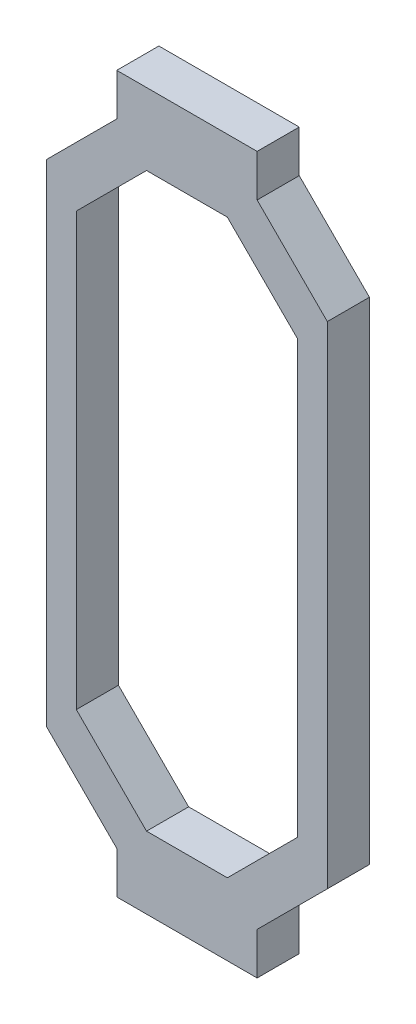
ISO-10303-21;
HEADER;
FILE_DESCRIPTION(('STEP AP214'),'2;1');
FILE_NAME('part.step','',(''),(''),'','','');
FILE_SCHEMA(('AUTOMOTIVE_DESIGN { 1 0 10303 214 1 1 1 1 }'));
ENDSEC;
DATA;
#1=APPLICATION_CONTEXT('core data for automotive mechanical design processes');
#2=APPLICATION_PROTOCOL_DEFINITION('international standard','automotive_design',2000,#1);
#3=PRODUCT_CONTEXT('',#1,'mechanical');
#4=PRODUCT('Part','Part','',(#3));
#5=PRODUCT_RELATED_PRODUCT_CATEGORY('part','',(#4));
#6=PRODUCT_DEFINITION_FORMATION('','',#4);
#7=PRODUCT_DEFINITION_CONTEXT('part definition',#1,'design');
#8=PRODUCT_DEFINITION('design','',#6,#7);
#9=PRODUCT_DEFINITION_SHAPE('','',#8);
#10=(LENGTH_UNIT() NAMED_UNIT(*) SI_UNIT(.MILLI.,.METRE.));
#11=(NAMED_UNIT(*) PLANE_ANGLE_UNIT() SI_UNIT($,.RADIAN.));
#12=(NAMED_UNIT(*) SI_UNIT($,.STERADIAN.) SOLID_ANGLE_UNIT());
#13=UNCERTAINTY_MEASURE_WITH_UNIT(LENGTH_MEASURE(1.E-05),#10,'distance_accuracy_value','');
#14=(GEOMETRIC_REPRESENTATION_CONTEXT(3) GLOBAL_UNCERTAINTY_ASSIGNED_CONTEXT((#13)) GLOBAL_UNIT_ASSIGNED_CONTEXT((#10,
#11,#12)) REPRESENTATION_CONTEXT('',''));
#15=CARTESIAN_POINT('',(0.,0.,0.));
#16=DIRECTION('',(0.,0.,1.));
#17=DIRECTION('',(1.,0.,0.));
#18=AXIS2_PLACEMENT_3D('',#15,#16,#17);
#19=CARTESIAN_POINT('',(0.,0.,6.));
#20=DIRECTION('',(0.,0.,-1.));
#21=DIRECTION('',(-1.,0.,0.));
#22=AXIS2_PLACEMENT_3D('',#19,#20,#21);
#23=PLANE('',#22);
#24=DIRECTION('',(-0.707106781186548,-0.707106781186547,0.));
#25=VECTOR('',#24,1.);
#26=CARTESIAN_POINT('',(-20.,35.,6.));
#27=LINE('',#26,#25);
#28=CARTESIAN_POINT('',(-10.,45.,6.));
#29=VERTEX_POINT('',#28);
#30=CARTESIAN_POINT('',(-20.,35.,6.));
#31=VERTEX_POINT('',#30);
#32=EDGE_CURVE('E235',#29,#31,#27,.T.);
#33=ORIENTED_EDGE('',*,*,#32,.T.);
#34=DIRECTION('',(0.,-1.,0.));
#35=VECTOR('',#34,1.);
#36=CARTESIAN_POINT('',(-20.,35.,6.));
#37=LINE('',#36,#35);
#38=CARTESIAN_POINT('',(-20.,-35.,6.));
#39=VERTEX_POINT('',#38);
#40=EDGE_CURVE('E238',#31,#39,#37,.T.);
#41=ORIENTED_EDGE('',*,*,#40,.T.);
#42=DIRECTION('',(0.707106781186546,-0.707106781186549,0.));
#43=VECTOR('',#42,1.);
#44=CARTESIAN_POINT('',(-20.,-35.,6.));
#45=LINE('',#44,#43);
#46=CARTESIAN_POINT('',(-10.0000000000001,-45.,6.));
#47=VERTEX_POINT('',#46);
#48=EDGE_CURVE('E241',#39,#47,#45,.T.);
#49=ORIENTED_EDGE('',*,*,#48,.T.);
#50=DIRECTION('',(0.,-1.,0.));
#51=VECTOR('',#50,1.);
#52=CARTESIAN_POINT('',(-10.0000000000001,-45.,6.));
#53=LINE('',#52,#51);
#54=CARTESIAN_POINT('',(-10.0000000000001,-51.,6.));
#55=VERTEX_POINT('',#54);
#56=EDGE_CURVE('E243',#47,#55,#53,.T.);
#57=ORIENTED_EDGE('',*,*,#56,.T.);
#58=DIRECTION('',(1.,0.,0.));
#59=VECTOR('',#58,1.);
#60=CARTESIAN_POINT('',(9.99999999999993,-51.,6.));
#61=LINE('',#60,#59);
#62=CARTESIAN_POINT('',(9.99999999999993,-51.,6.));
#63=VERTEX_POINT('',#62);
#64=EDGE_CURVE('E245',#55,#63,#61,.T.);
#65=ORIENTED_EDGE('',*,*,#64,.T.);
#66=DIRECTION('',(0.,1.,0.));
#67=VECTOR('',#66,1.);
#68=CARTESIAN_POINT('',(9.99999999999994,-45.,6.));
#69=LINE('',#68,#67);
#70=CARTESIAN_POINT('',(9.99999999999994,-45.,6.));
#71=VERTEX_POINT('',#70);
#72=EDGE_CURVE('E247',#63,#71,#69,.T.);
#73=ORIENTED_EDGE('',*,*,#72,.T.);
#74=DIRECTION('',(0.707106781186549,0.707106781186546,0.));
#75=VECTOR('',#74,1.);
#76=CARTESIAN_POINT('',(9.99999999999994,-45.,6.));
#77=LINE('',#76,#75);
#78=CARTESIAN_POINT('',(20.,-35.,6.));
#79=VERTEX_POINT('',#78);
#80=EDGE_CURVE('E249',#71,#79,#77,.T.);
#81=ORIENTED_EDGE('',*,*,#80,.T.);
#82=DIRECTION('',(0.,1.,0.));
#83=VECTOR('',#82,1.);
#84=CARTESIAN_POINT('',(20.,-35.,6.));
#85=LINE('',#84,#83);
#86=CARTESIAN_POINT('',(20.,35.,6.));
#87=VERTEX_POINT('',#86);
#88=EDGE_CURVE('E251',#79,#87,#85,.T.);
#89=ORIENTED_EDGE('',*,*,#88,.T.);
#90=DIRECTION('',(-0.707106781186548,0.707106781186547,0.));
#91=VECTOR('',#90,1.);
#92=CARTESIAN_POINT('',(10.,45.,6.));
#93=LINE('',#92,#91);
#94=CARTESIAN_POINT('',(10.,45.,6.));
#95=VERTEX_POINT('',#94);
#96=EDGE_CURVE('E253',#87,#95,#93,.T.);
#97=ORIENTED_EDGE('',*,*,#96,.T.);
#98=DIRECTION('',(0.,1.,0.));
#99=VECTOR('',#98,1.);
#100=CARTESIAN_POINT('',(10.,45.,6.));
#101=LINE('',#100,#99);
#102=CARTESIAN_POINT('',(10.,51.,6.));
#103=VERTEX_POINT('',#102);
#104=EDGE_CURVE('E255',#95,#103,#101,.T.);
#105=ORIENTED_EDGE('',*,*,#104,.T.);
#106=DIRECTION('',(-1.,0.,0.));
#107=VECTOR('',#106,1.);
#108=CARTESIAN_POINT('',(10.,51.,6.));
#109=LINE('',#108,#107);
#110=CARTESIAN_POINT('',(-10.,51.,6.));
#111=VERTEX_POINT('',#110);
#112=EDGE_CURVE('E257',#103,#111,#109,.T.);
#113=ORIENTED_EDGE('',*,*,#112,.T.);
#114=DIRECTION('',(0.,-1.,0.));
#115=VECTOR('',#114,1.);
#116=CARTESIAN_POINT('',(-10.,45.,6.));
#117=LINE('',#116,#115);
#118=EDGE_CURVE('E259',#111,#29,#117,.T.);
#119=ORIENTED_EDGE('',*,*,#118,.T.);
#120=EDGE_LOOP('',(#33,#41,#49,#57,#65,#73,#81,#89,#97,#105,#113,#119));
#121=FACE_BOUND('',#120,.T.);
#122=DIRECTION('',(-1.,0.,0.));
#123=VECTOR('',#122,1.);
#124=CARTESIAN_POINT('',(5.75735931288071,40.7573593128807,6.));
#125=LINE('',#124,#123);
#126=CARTESIAN_POINT('',(5.75735931288071,40.7573593128807,6.));
#127=VERTEX_POINT('',#126);
#128=CARTESIAN_POINT('',(-5.75735931288071,40.7573593128807,6.));
#129=VERTEX_POINT('',#128);
#130=EDGE_CURVE('E170',#127,#129,#125,.T.);
#131=ORIENTED_EDGE('',*,*,#130,.F.);
#132=DIRECTION('',(-0.707106781186547,0.707106781186548,0.));
#133=VECTOR('',#132,1.);
#134=CARTESIAN_POINT('',(5.75735931288071,40.7573593128807,6.));
#135=LINE('',#134,#133);
#136=CARTESIAN_POINT('',(15.7573593128807,30.7573593128807,6.));
#137=VERTEX_POINT('',#136);
#138=EDGE_CURVE('E203',#137,#127,#135,.T.);
#139=ORIENTED_EDGE('',*,*,#138,.F.);
#140=DIRECTION('',(0.,1.,0.));
#141=VECTOR('',#140,1.);
#142=CARTESIAN_POINT('',(15.7573593128807,-30.7573593128807,6.));
#143=LINE('',#142,#141);
#144=CARTESIAN_POINT('',(15.7573593128807,-30.7573593128807,6.));
#145=VERTEX_POINT('',#144);
#146=EDGE_CURVE('E201',#145,#137,#143,.T.);
#147=ORIENTED_EDGE('',*,*,#146,.F.);
#148=DIRECTION('',(0.707106781186547,0.707106781186547,0.));
#149=VECTOR('',#148,1.);
#150=CARTESIAN_POINT('',(5.75735931288066,-40.7573593128807,6.));
#151=LINE('',#150,#149);
#152=CARTESIAN_POINT('',(5.75735931288066,-40.7573593128807,6.));
#153=VERTEX_POINT('',#152);
#154=EDGE_CURVE('E199',#153,#145,#151,.T.);
#155=ORIENTED_EDGE('',*,*,#154,.F.);
#156=DIRECTION('',(1.,0.,0.));
#157=VECTOR('',#156,1.);
#158=CARTESIAN_POINT('',(-5.75735931288075,-40.7573593128807,6.));
#159=LINE('',#158,#157);
#160=CARTESIAN_POINT('',(-5.75735931288075,-40.7573593128807,6.));
#161=VERTEX_POINT('',#160);
#162=EDGE_CURVE('E197',#161,#153,#159,.T.);
#163=ORIENTED_EDGE('',*,*,#162,.F.);
#164=DIRECTION('',(0.707106781186548,-0.707106781186548,0.));
#165=VECTOR('',#164,1.);
#166=CARTESIAN_POINT('',(-15.7573593128807,-30.7573593128807,6.));
#167=LINE('',#166,#165);
#168=CARTESIAN_POINT('',(-15.7573593128807,-30.7573593128807,6.));
#169=VERTEX_POINT('',#168);
#170=EDGE_CURVE('E193',#169,#161,#167,.T.);
#171=ORIENTED_EDGE('',*,*,#170,.F.);
#172=DIRECTION('',(0.,-1.,0.));
#173=VECTOR('',#172,1.);
#174=CARTESIAN_POINT('',(-15.7573593128807,30.7573593128807,6.));
#175=LINE('',#174,#173);
#176=CARTESIAN_POINT('',(-15.7573593128807,30.7573593128807,6.));
#177=VERTEX_POINT('',#176);
#178=EDGE_CURVE('E191',#177,#169,#175,.T.);
#179=ORIENTED_EDGE('',*,*,#178,.F.);
#180=DIRECTION('',(-0.707106781186547,-0.707106781186548,0.));
#181=VECTOR('',#180,1.);
#182=CARTESIAN_POINT('',(-15.7573593128807,30.7573593128807,6.));
#183=LINE('',#182,#181);
#184=EDGE_CURVE('E178',#129,#177,#183,.T.);
#185=ORIENTED_EDGE('',*,*,#184,.F.);
#186=EDGE_LOOP('',(#131,#139,#147,#155,#163,#171,#179,#185));
#187=FACE_BOUND('',#186,.T.);
#188=ADVANCED_FACE('F33',(#121,#187),#23,.F.);
#189=CARTESIAN_POINT('',(0.,0.,0.));
#190=DIRECTION('',(0.,0.,-1.));
#191=DIRECTION('',(-1.,0.,0.));
#192=AXIS2_PLACEMENT_3D('',#189,#190,#191);
#193=PLANE('',#192);
#194=DIRECTION('',(-0.707106781186548,-0.707106781186547,0.));
#195=VECTOR('',#194,1.);
#196=CARTESIAN_POINT('',(-20.,35.,0.));
#197=LINE('',#196,#195);
#198=CARTESIAN_POINT('',(-10.,45.,0.));
#199=VERTEX_POINT('',#198);
#200=CARTESIAN_POINT('',(-20.,35.,0.));
#201=VERTEX_POINT('',#200);
#202=EDGE_CURVE('E186',#199,#201,#197,.T.);
#203=ORIENTED_EDGE('',*,*,#202,.F.);
#204=DIRECTION('',(0.,-1.,0.));
#205=VECTOR('',#204,1.);
#206=CARTESIAN_POINT('',(-10.,45.,0.));
#207=LINE('',#206,#205);
#208=CARTESIAN_POINT('',(-10.,51.,0.));
#209=VERTEX_POINT('',#208);
#210=EDGE_CURVE('E239',#209,#199,#207,.T.);
#211=ORIENTED_EDGE('',*,*,#210,.F.);
#212=DIRECTION('',(-1.,0.,0.));
#213=VECTOR('',#212,1.);
#214=CARTESIAN_POINT('',(10.,51.,0.));
#215=LINE('',#214,#213);
#216=CARTESIAN_POINT('',(10.,51.,0.));
#217=VERTEX_POINT('',#216);
#218=EDGE_CURVE('E282',#217,#209,#215,.T.);
#219=ORIENTED_EDGE('',*,*,#218,.F.);
#220=DIRECTION('',(0.,1.,0.));
#221=VECTOR('',#220,1.);
#222=CARTESIAN_POINT('',(10.,45.,0.));
#223=LINE('',#222,#221);
#224=CARTESIAN_POINT('',(10.,45.,0.));
#225=VERTEX_POINT('',#224);
#226=EDGE_CURVE('E280',#225,#217,#223,.T.);
#227=ORIENTED_EDGE('',*,*,#226,.F.);
#228=DIRECTION('',(-0.707106781186548,0.707106781186547,0.));
#229=VECTOR('',#228,1.);
#230=CARTESIAN_POINT('',(10.,45.,0.));
#231=LINE('',#230,#229);
#232=CARTESIAN_POINT('',(20.,35.,0.));
#233=VERTEX_POINT('',#232);
#234=EDGE_CURVE('E278',#233,#225,#231,.T.);
#235=ORIENTED_EDGE('',*,*,#234,.F.);
#236=DIRECTION('',(0.,1.,0.));
#237=VECTOR('',#236,1.);
#238=CARTESIAN_POINT('',(20.,-35.,0.));
#239=LINE('',#238,#237);
#240=CARTESIAN_POINT('',(20.,-35.,0.));
#241=VERTEX_POINT('',#240);
#242=EDGE_CURVE('E276',#241,#233,#239,.T.);
#243=ORIENTED_EDGE('',*,*,#242,.F.);
#244=DIRECTION('',(0.707106781186549,0.707106781186546,0.));
#245=VECTOR('',#244,1.);
#246=CARTESIAN_POINT('',(9.99999999999994,-45.,0.));
#247=LINE('',#246,#245);
#248=CARTESIAN_POINT('',(9.99999999999994,-45.,0.));
#249=VERTEX_POINT('',#248);
#250=EDGE_CURVE('E274',#249,#241,#247,.T.);
#251=ORIENTED_EDGE('',*,*,#250,.F.);
#252=DIRECTION('',(0.,1.,0.));
#253=VECTOR('',#252,1.);
#254=CARTESIAN_POINT('',(9.99999999999994,-45.,0.));
#255=LINE('',#254,#253);
#256=CARTESIAN_POINT('',(9.99999999999993,-51.,0.));
#257=VERTEX_POINT('',#256);
#258=EDGE_CURVE('E272',#257,#249,#255,.T.);
#259=ORIENTED_EDGE('',*,*,#258,.F.);
#260=DIRECTION('',(1.,0.,0.));
#261=VECTOR('',#260,1.);
#262=CARTESIAN_POINT('',(9.99999999999993,-51.,0.));
#263=LINE('',#262,#261);
#264=CARTESIAN_POINT('',(-10.0000000000001,-51.,0.));
#265=VERTEX_POINT('',#264);
#266=EDGE_CURVE('E270',#265,#257,#263,.T.);
#267=ORIENTED_EDGE('',*,*,#266,.F.);
#268=DIRECTION('',(0.,-1.,0.));
#269=VECTOR('',#268,1.);
#270=CARTESIAN_POINT('',(-10.0000000000001,-45.,0.));
#271=LINE('',#270,#269);
#272=CARTESIAN_POINT('',(-10.0000000000001,-45.,0.));
#273=VERTEX_POINT('',#272);
#274=EDGE_CURVE('E268',#273,#265,#271,.T.);
#275=ORIENTED_EDGE('',*,*,#274,.F.);
#276=DIRECTION('',(0.707106781186546,-0.707106781186549,0.));
#277=VECTOR('',#276,1.);
#278=CARTESIAN_POINT('',(-20.,-35.,0.));
#279=LINE('',#278,#277);
#280=CARTESIAN_POINT('',(-20.,-35.,0.));
#281=VERTEX_POINT('',#280);
#282=EDGE_CURVE('E266',#281,#273,#279,.T.);
#283=ORIENTED_EDGE('',*,*,#282,.F.);
#284=DIRECTION('',(0.,-1.,0.));
#285=VECTOR('',#284,1.);
#286=CARTESIAN_POINT('',(-20.,35.,0.));
#287=LINE('',#286,#285);
#288=EDGE_CURVE('E264',#201,#281,#287,.T.);
#289=ORIENTED_EDGE('',*,*,#288,.F.);
#290=EDGE_LOOP('',(#203,#211,#219,#227,#235,#243,#251,#259,#267,#275,#283,#289));
#291=FACE_BOUND('',#290,.T.);
#292=DIRECTION('',(-0.707106781186547,0.707106781186548,0.));
#293=VECTOR('',#292,1.);
#294=CARTESIAN_POINT('',(5.75735931288071,40.7573593128807,0.));
#295=LINE('',#294,#293);
#296=CARTESIAN_POINT('',(15.7573593128807,30.7573593128807,0.));
#297=VERTEX_POINT('',#296);
#298=CARTESIAN_POINT('',(5.75735931288071,40.7573593128807,0.));
#299=VERTEX_POINT('',#298);
#300=EDGE_CURVE('E179',#297,#299,#295,.T.);
#301=ORIENTED_EDGE('',*,*,#300,.T.);
#302=DIRECTION('',(-1.,0.,0.));
#303=VECTOR('',#302,1.);
#304=CARTESIAN_POINT('',(5.75735931288071,40.7573593128807,0.));
#305=LINE('',#304,#303);
#306=CARTESIAN_POINT('',(-5.75735931288071,40.7573593128807,0.));
#307=VERTEX_POINT('',#306);
#308=EDGE_CURVE('E56',#299,#307,#305,.T.);
#309=ORIENTED_EDGE('',*,*,#308,.T.);
#310=DIRECTION('',(-0.707106781186547,-0.707106781186548,0.));
#311=VECTOR('',#310,1.);
#312=CARTESIAN_POINT('',(-15.7573593128807,30.7573593128807,0.));
#313=LINE('',#312,#311);
#314=CARTESIAN_POINT('',(-15.7573593128807,30.7573593128807,0.));
#315=VERTEX_POINT('',#314);
#316=EDGE_CURVE('E185',#307,#315,#313,.T.);
#317=ORIENTED_EDGE('',*,*,#316,.T.);
#318=DIRECTION('',(0.,-1.,0.));
#319=VECTOR('',#318,1.);
#320=CARTESIAN_POINT('',(-15.7573593128807,30.7573593128807,0.));
#321=LINE('',#320,#319);
#322=CARTESIAN_POINT('',(-15.7573593128807,-30.7573593128807,0.));
#323=VERTEX_POINT('',#322);
#324=EDGE_CURVE('E207',#315,#323,#321,.T.);
#325=ORIENTED_EDGE('',*,*,#324,.T.);
#326=DIRECTION('',(0.707106781186548,-0.707106781186548,0.));
#327=VECTOR('',#326,1.);
#328=CARTESIAN_POINT('',(-15.7573593128807,-30.7573593128807,0.));
#329=LINE('',#328,#327);
#330=CARTESIAN_POINT('',(-5.75735931288075,-40.7573593128807,0.));
#331=VERTEX_POINT('',#330);
#332=EDGE_CURVE('E210',#323,#331,#329,.T.);
#333=ORIENTED_EDGE('',*,*,#332,.T.);
#334=DIRECTION('',(1.,0.,0.));
#335=VECTOR('',#334,1.);
#336=CARTESIAN_POINT('',(-5.75735931288075,-40.7573593128807,0.));
#337=LINE('',#336,#335);
#338=CARTESIAN_POINT('',(5.75735931288066,-40.7573593128807,0.));
#339=VERTEX_POINT('',#338);
#340=EDGE_CURVE('E213',#331,#339,#337,.T.);
#341=ORIENTED_EDGE('',*,*,#340,.T.);
#342=DIRECTION('',(0.707106781186547,0.707106781186547,0.));
#343=VECTOR('',#342,1.);
#344=CARTESIAN_POINT('',(5.75735931288066,-40.7573593128807,0.));
#345=LINE('',#344,#343);
#346=CARTESIAN_POINT('',(15.7573593128807,-30.7573593128807,0.));
#347=VERTEX_POINT('',#346);
#348=EDGE_CURVE('E216',#339,#347,#345,.T.);
#349=ORIENTED_EDGE('',*,*,#348,.T.);
#350=DIRECTION('',(0.,1.,0.));
#351=VECTOR('',#350,1.);
#352=CARTESIAN_POINT('',(15.7573593128807,-30.7573593128807,0.));
#353=LINE('',#352,#351);
#354=EDGE_CURVE('E219',#347,#297,#353,.T.);
#355=ORIENTED_EDGE('',*,*,#354,.T.);
#356=EDGE_LOOP('',(#301,#309,#317,#325,#333,#341,#349,#355));
#357=FACE_BOUND('',#356,.T.);
#358=ADVANCED_FACE('F324',(#291,#357),#193,.T.);
#359=CARTESIAN_POINT('',(-20.,35.,6.));
#360=DIRECTION('',(0.707106781186547,-0.707106781186548,0.));
#361=DIRECTION('',(0.707106781186548,0.707106781186547,0.));
#362=AXIS2_PLACEMENT_3D('',#359,#360,#361);
#363=PLANE('',#362);
#364=ORIENTED_EDGE('',*,*,#202,.T.);
#365=DIRECTION('',(0.,0.,-1.));
#366=VECTOR('',#365,1.);
#367=CARTESIAN_POINT('',(-20.,35.,6.));
#368=LINE('',#367,#366);
#369=EDGE_CURVE('E11',#31,#201,#368,.T.);
#370=ORIENTED_EDGE('',*,*,#369,.F.);
#371=ORIENTED_EDGE('',*,*,#32,.F.);
#372=DIRECTION('',(0.,0.,-1.));
#373=VECTOR('',#372,1.);
#374=CARTESIAN_POINT('',(-10.,45.,6.));
#375=LINE('',#374,#373);
#376=EDGE_CURVE('E261',#29,#199,#375,.T.);
#377=ORIENTED_EDGE('',*,*,#376,.T.);
#378=EDGE_LOOP('',(#364,#370,#371,#377));
#379=FACE_BOUND('',#378,.T.);
#380=ADVANCED_FACE('F35',(#379),#363,.F.);
#381=CARTESIAN_POINT('',(-20.,35.,6.));
#382=DIRECTION('',(1.,0.,0.));
#383=DIRECTION('',(0.,0.,-1.));
#384=AXIS2_PLACEMENT_3D('',#381,#382,#383);
#385=PLANE('',#384);
#386=ORIENTED_EDGE('',*,*,#288,.T.);
#387=DIRECTION('',(0.,0.,-1.));
#388=VECTOR('',#387,1.);
#389=CARTESIAN_POINT('',(-20.,-35.,6.));
#390=LINE('',#389,#388);
#391=EDGE_CURVE('E41',#39,#281,#390,.T.);
#392=ORIENTED_EDGE('',*,*,#391,.F.);
#393=ORIENTED_EDGE('',*,*,#40,.F.);
#394=ORIENTED_EDGE('',*,*,#369,.T.);
#395=EDGE_LOOP('',(#386,#392,#393,#394));
#396=FACE_BOUND('',#395,.T.);
#397=ADVANCED_FACE('F341',(#396),#385,.F.);
#398=CARTESIAN_POINT('',(-20.,-35.,6.));
#399=DIRECTION('',(0.707106781186549,0.707106781186546,0.));
#400=DIRECTION('',(-0.707106781186546,0.707106781186549,0.));
#401=AXIS2_PLACEMENT_3D('',#398,#399,#400);
#402=PLANE('',#401);
#403=ORIENTED_EDGE('',*,*,#282,.T.);
#404=DIRECTION('',(0.,0.,-1.));
#405=VECTOR('',#404,1.);
#406=CARTESIAN_POINT('',(-10.0000000000001,-45.,6.));
#407=LINE('',#406,#405);
#408=EDGE_CURVE('E311',#47,#273,#407,.T.);
#409=ORIENTED_EDGE('',*,*,#408,.F.);
#410=ORIENTED_EDGE('',*,*,#48,.F.);
#411=ORIENTED_EDGE('',*,*,#391,.T.);
#412=EDGE_LOOP('',(#403,#409,#410,#411));
#413=FACE_BOUND('',#412,.T.);
#414=ADVANCED_FACE('F318',(#413),#402,.F.);
#415=CARTESIAN_POINT('',(-10.0000000000001,-45.,6.));
#416=DIRECTION('',(1.,0.,0.));
#417=DIRECTION('',(0.,1.,0.));
#418=AXIS2_PLACEMENT_3D('',#415,#416,#417);
#419=PLANE('',#418);
#420=ORIENTED_EDGE('',*,*,#274,.T.);
#421=DIRECTION('',(0.,0.,-1.));
#422=VECTOR('',#421,1.);
#423=CARTESIAN_POINT('',(-10.0000000000001,-51.,6.));
#424=LINE('',#423,#422);
#425=EDGE_CURVE('E308',#55,#265,#424,.T.);
#426=ORIENTED_EDGE('',*,*,#425,.F.);
#427=ORIENTED_EDGE('',*,*,#56,.F.);
#428=ORIENTED_EDGE('',*,*,#408,.T.);
#429=EDGE_LOOP('',(#420,#426,#427,#428));
#430=FACE_BOUND('',#429,.T.);
#431=ADVANCED_FACE('F330',(#430),#419,.F.);
#432=CARTESIAN_POINT('',(9.99999999999993,-51.,6.));
#433=DIRECTION('',(0.,1.,0.));
#434=DIRECTION('',(-1.,0.,0.));
#435=AXIS2_PLACEMENT_3D('',#432,#433,#434);
#436=PLANE('',#435);
#437=ORIENTED_EDGE('',*,*,#266,.T.);
#438=DIRECTION('',(0.,0.,-1.));
#439=VECTOR('',#438,1.);
#440=CARTESIAN_POINT('',(9.99999999999993,-51.,6.));
#441=LINE('',#440,#439);
#442=EDGE_CURVE('E305',#63,#257,#441,.T.);
#443=ORIENTED_EDGE('',*,*,#442,.F.);
#444=ORIENTED_EDGE('',*,*,#64,.F.);
#445=ORIENTED_EDGE('',*,*,#425,.T.);
#446=EDGE_LOOP('',(#437,#443,#444,#445));
#447=FACE_BOUND('',#446,.T.);
#448=ADVANCED_FACE('F334',(#447),#436,.F.);
#449=CARTESIAN_POINT('',(9.99999999999994,-45.,6.));
#450=DIRECTION('',(-1.,0.,0.));
#451=DIRECTION('',(0.,-1.,0.));
#452=AXIS2_PLACEMENT_3D('',#449,#450,#451);
#453=PLANE('',#452);
#454=ORIENTED_EDGE('',*,*,#258,.T.);
#455=DIRECTION('',(0.,0.,-1.));
#456=VECTOR('',#455,1.);
#457=CARTESIAN_POINT('',(9.99999999999994,-45.,6.));
#458=LINE('',#457,#456);
#459=EDGE_CURVE('E302',#71,#249,#458,.T.);
#460=ORIENTED_EDGE('',*,*,#459,.F.);
#461=ORIENTED_EDGE('',*,*,#72,.F.);
#462=ORIENTED_EDGE('',*,*,#442,.T.);
#463=EDGE_LOOP('',(#454,#460,#461,#462));
#464=FACE_BOUND('',#463,.T.);
#465=ADVANCED_FACE('F374',(#464),#453,.F.);
#466=CARTESIAN_POINT('',(9.99999999999994,-45.,6.));
#467=DIRECTION('',(-0.707106781186546,0.707106781186549,0.));
#468=DIRECTION('',(-0.707106781186549,-0.707106781186546,0.));
#469=AXIS2_PLACEMENT_3D('',#466,#467,#468);
#470=PLANE('',#469);
#471=ORIENTED_EDGE('',*,*,#250,.T.);
#472=DIRECTION('',(0.,0.,-1.));
#473=VECTOR('',#472,1.);
#474=CARTESIAN_POINT('',(20.,-35.,6.));
#475=LINE('',#474,#473);
#476=EDGE_CURVE('E299',#79,#241,#475,.T.);
#477=ORIENTED_EDGE('',*,*,#476,.F.);
#478=ORIENTED_EDGE('',*,*,#80,.F.);
#479=ORIENTED_EDGE('',*,*,#459,.T.);
#480=EDGE_LOOP('',(#471,#477,#478,#479));
#481=FACE_BOUND('',#480,.T.);
#482=ADVANCED_FACE('F372',(#481),#470,.F.);
#483=CARTESIAN_POINT('',(20.,-35.,6.));
#484=DIRECTION('',(-1.,0.,0.));
#485=DIRECTION('',(0.,0.,1.));
#486=AXIS2_PLACEMENT_3D('',#483,#484,#485);
#487=PLANE('',#486);
#488=ORIENTED_EDGE('',*,*,#242,.T.);
#489=DIRECTION('',(0.,0.,-1.));
#490=VECTOR('',#489,1.);
#491=CARTESIAN_POINT('',(20.,35.,6.));
#492=LINE('',#491,#490);
#493=EDGE_CURVE('E296',#87,#233,#492,.T.);
#494=ORIENTED_EDGE('',*,*,#493,.F.);
#495=ORIENTED_EDGE('',*,*,#88,.F.);
#496=ORIENTED_EDGE('',*,*,#476,.T.);
#497=EDGE_LOOP('',(#488,#494,#495,#496));
#498=FACE_BOUND('',#497,.T.);
#499=ADVANCED_FACE('F368',(#498),#487,.F.);
#500=CARTESIAN_POINT('',(10.,45.,6.));
#501=DIRECTION('',(-0.707106781186547,-0.707106781186548,0.));
#502=DIRECTION('',(0.707106781186548,-0.707106781186547,0.));
#503=AXIS2_PLACEMENT_3D('',#500,#501,#502);
#504=PLANE('',#503);
#505=ORIENTED_EDGE('',*,*,#234,.T.);
#506=DIRECTION('',(0.,0.,-1.));
#507=VECTOR('',#506,1.);
#508=CARTESIAN_POINT('',(10.,45.,6.));
#509=LINE('',#508,#507);
#510=EDGE_CURVE('E293',#95,#225,#509,.T.);
#511=ORIENTED_EDGE('',*,*,#510,.F.);
#512=ORIENTED_EDGE('',*,*,#96,.F.);
#513=ORIENTED_EDGE('',*,*,#493,.T.);
#514=EDGE_LOOP('',(#505,#511,#512,#513));
#515=FACE_BOUND('',#514,.T.);
#516=ADVANCED_FACE('F363',(#515),#504,.F.);
#517=CARTESIAN_POINT('',(10.,45.,6.));
#518=DIRECTION('',(-1.,0.,0.));
#519=DIRECTION('',(0.,0.,1.));
#520=AXIS2_PLACEMENT_3D('',#517,#518,#519);
#521=PLANE('',#520);
#522=ORIENTED_EDGE('',*,*,#226,.T.);
#523=DIRECTION('',(0.,0.,-1.));
#524=VECTOR('',#523,1.);
#525=CARTESIAN_POINT('',(10.,51.,6.));
#526=LINE('',#525,#524);
#527=EDGE_CURVE('E290',#103,#217,#526,.T.);
#528=ORIENTED_EDGE('',*,*,#527,.F.);
#529=ORIENTED_EDGE('',*,*,#104,.F.);
#530=ORIENTED_EDGE('',*,*,#510,.T.);
#531=EDGE_LOOP('',(#522,#528,#529,#530));
#532=FACE_BOUND('',#531,.T.);
#533=ADVANCED_FACE('F357',(#532),#521,.F.);
#534=CARTESIAN_POINT('',(10.,51.,6.));
#535=DIRECTION('',(0.,-1.,0.));
#536=DIRECTION('',(0.,0.,-1.));
#537=AXIS2_PLACEMENT_3D('',#534,#535,#536);
#538=PLANE('',#537);
#539=ORIENTED_EDGE('',*,*,#218,.T.);
#540=DIRECTION('',(0.,0.,-1.));
#541=VECTOR('',#540,1.);
#542=CARTESIAN_POINT('',(-10.,51.,6.));
#543=LINE('',#542,#541);
#544=EDGE_CURVE('E287',#111,#209,#543,.T.);
#545=ORIENTED_EDGE('',*,*,#544,.F.);
#546=ORIENTED_EDGE('',*,*,#112,.F.);
#547=ORIENTED_EDGE('',*,*,#527,.T.);
#548=EDGE_LOOP('',(#539,#545,#546,#547));
#549=FACE_BOUND('',#548,.T.);
#550=ADVANCED_FACE('F353',(#549),#538,.F.);
#551=CARTESIAN_POINT('',(-10.,45.,6.));
#552=DIRECTION('',(1.,0.,0.));
#553=DIRECTION('',(0.,0.,-1.));
#554=AXIS2_PLACEMENT_3D('',#551,#552,#553);
#555=PLANE('',#554);
#556=ORIENTED_EDGE('',*,*,#210,.T.);
#557=ORIENTED_EDGE('',*,*,#376,.F.);
#558=ORIENTED_EDGE('',*,*,#118,.F.);
#559=ORIENTED_EDGE('',*,*,#544,.T.);
#560=EDGE_LOOP('',(#556,#557,#558,#559));
#561=FACE_BOUND('',#560,.T.);
#562=ADVANCED_FACE('F348',(#561),#555,.F.);
#563=CARTESIAN_POINT('',(5.75735931288071,40.7573593128807,6.));
#564=DIRECTION('',(0.,-1.,0.));
#565=DIRECTION('',(1.,0.,0.));
#566=AXIS2_PLACEMENT_3D('',#563,#564,#565);
#567=PLANE('',#566);
#568=ORIENTED_EDGE('',*,*,#308,.F.);
#569=DIRECTION('',(0.,0.,-1.));
#570=VECTOR('',#569,1.);
#571=CARTESIAN_POINT('',(5.75735931288071,40.7573593128807,6.));
#572=LINE('',#571,#570);
#573=EDGE_CURVE('E174',#127,#299,#572,.T.);
#574=ORIENTED_EDGE('',*,*,#573,.F.);
#575=ORIENTED_EDGE('',*,*,#130,.T.);
#576=DIRECTION('',(0.,0.,-1.));
#577=VECTOR('',#576,1.);
#578=CARTESIAN_POINT('',(-5.75735931288071,40.7573593128807,6.));
#579=LINE('',#578,#577);
#580=EDGE_CURVE('E173',#129,#307,#579,.T.);
#581=ORIENTED_EDGE('',*,*,#580,.T.);
#582=EDGE_LOOP('',(#568,#574,#575,#581));
#583=FACE_BOUND('',#582,.T.);
#584=ADVANCED_FACE('F172',(#583),#567,.T.);
#585=CARTESIAN_POINT('',(-15.7573593128807,30.7573593128807,6.));
#586=DIRECTION('',(0.707106781186548,-0.707106781186547,0.));
#587=DIRECTION('',(0.707106781186547,0.707106781186548,0.));
#588=AXIS2_PLACEMENT_3D('',#585,#586,#587);
#589=PLANE('',#588);
#590=ORIENTED_EDGE('',*,*,#316,.F.);
#591=ORIENTED_EDGE('',*,*,#580,.F.);
#592=ORIENTED_EDGE('',*,*,#184,.T.);
#593=DIRECTION('',(0.,0.,-1.));
#594=VECTOR('',#593,1.);
#595=CARTESIAN_POINT('',(-15.7573593128807,30.7573593128807,6.));
#596=LINE('',#595,#594);
#597=EDGE_CURVE('E187',#177,#315,#596,.T.);
#598=ORIENTED_EDGE('',*,*,#597,.T.);
#599=EDGE_LOOP('',(#590,#591,#592,#598));
#600=FACE_BOUND('',#599,.T.);
#601=ADVANCED_FACE('F182',(#600),#589,.T.);
#602=CARTESIAN_POINT('',(-15.7573593128807,30.7573593128807,6.));
#603=DIRECTION('',(1.,0.,0.));
#604=DIRECTION('',(0.,0.,-1.));
#605=AXIS2_PLACEMENT_3D('',#602,#603,#604);
#606=PLANE('',#605);
#607=ORIENTED_EDGE('',*,*,#324,.F.);
#608=ORIENTED_EDGE('',*,*,#597,.F.);
#609=ORIENTED_EDGE('',*,*,#178,.T.);
#610=DIRECTION('',(0.,0.,-1.));
#611=VECTOR('',#610,1.);
#612=CARTESIAN_POINT('',(-15.7573593128807,-30.7573593128807,6.));
#613=LINE('',#612,#611);
#614=EDGE_CURVE('E232',#169,#323,#613,.T.);
#615=ORIENTED_EDGE('',*,*,#614,.T.);
#616=EDGE_LOOP('',(#607,#608,#609,#615));
#617=FACE_BOUND('',#616,.T.);
#618=ADVANCED_FACE('F432',(#617),#606,.T.);
#619=CARTESIAN_POINT('',(-15.7573593128807,-30.7573593128807,6.));
#620=DIRECTION('',(0.707106781186548,0.707106781186547,0.));
#621=DIRECTION('',(-0.707106781186547,0.707106781186548,0.));
#622=AXIS2_PLACEMENT_3D('',#619,#620,#621);
#623=PLANE('',#622);
#624=ORIENTED_EDGE('',*,*,#332,.F.);
#625=ORIENTED_EDGE('',*,*,#614,.F.);
#626=ORIENTED_EDGE('',*,*,#170,.T.);
#627=DIRECTION('',(0.,0.,-1.));
#628=VECTOR('',#627,1.);
#629=CARTESIAN_POINT('',(-5.75735931288075,-40.7573593128807,6.));
#630=LINE('',#629,#628);
#631=EDGE_CURVE('E230',#161,#331,#630,.T.);
#632=ORIENTED_EDGE('',*,*,#631,.T.);
#633=EDGE_LOOP('',(#624,#625,#626,#632));
#634=FACE_BOUND('',#633,.T.);
#635=ADVANCED_FACE('F438',(#634),#623,.T.);
#636=CARTESIAN_POINT('',(-5.75735931288075,-40.7573593128807,6.));
#637=DIRECTION('',(0.,1.,0.));
#638=DIRECTION('',(-1.,0.,0.));
#639=AXIS2_PLACEMENT_3D('',#636,#637,#638);
#640=PLANE('',#639);
#641=ORIENTED_EDGE('',*,*,#340,.F.);
#642=ORIENTED_EDGE('',*,*,#631,.F.);
#643=ORIENTED_EDGE('',*,*,#162,.T.);
#644=DIRECTION('',(0.,0.,-1.));
#645=VECTOR('',#644,1.);
#646=CARTESIAN_POINT('',(5.75735931288066,-40.7573593128807,6.));
#647=LINE('',#646,#645);
#648=EDGE_CURVE('E228',#153,#339,#647,.T.);
#649=ORIENTED_EDGE('',*,*,#648,.T.);
#650=EDGE_LOOP('',(#641,#642,#643,#649));
#651=FACE_BOUND('',#650,.T.);
#652=ADVANCED_FACE('F446',(#651),#640,.T.);
#653=CARTESIAN_POINT('',(5.75735931288066,-40.7573593128807,6.));
#654=DIRECTION('',(-0.707106781186548,0.707106781186548,0.));
#655=DIRECTION('',(-0.707106781186548,-0.707106781186548,0.));
#656=AXIS2_PLACEMENT_3D('',#653,#654,#655);
#657=PLANE('',#656);
#658=ORIENTED_EDGE('',*,*,#348,.F.);
#659=ORIENTED_EDGE('',*,*,#648,.F.);
#660=ORIENTED_EDGE('',*,*,#154,.T.);
#661=DIRECTION('',(0.,0.,-1.));
#662=VECTOR('',#661,1.);
#663=CARTESIAN_POINT('',(15.7573593128807,-30.7573593128807,6.));
#664=LINE('',#663,#662);
#665=EDGE_CURVE('E226',#145,#347,#664,.T.);
#666=ORIENTED_EDGE('',*,*,#665,.T.);
#667=EDGE_LOOP('',(#658,#659,#660,#666));
#668=FACE_BOUND('',#667,.T.);
#669=ADVANCED_FACE('F454',(#668),#657,.T.);
#670=CARTESIAN_POINT('',(15.7573593128807,-30.7573593128807,6.));
#671=DIRECTION('',(-1.,0.,0.));
#672=DIRECTION('',(0.,-1.,0.));
#673=AXIS2_PLACEMENT_3D('',#670,#671,#672);
#674=PLANE('',#673);
#675=ORIENTED_EDGE('',*,*,#354,.F.);
#676=ORIENTED_EDGE('',*,*,#665,.F.);
#677=ORIENTED_EDGE('',*,*,#146,.T.);
#678=DIRECTION('',(0.,0.,-1.));
#679=VECTOR('',#678,1.);
#680=CARTESIAN_POINT('',(15.7573593128807,30.7573593128807,6.));
#681=LINE('',#680,#679);
#682=EDGE_CURVE('E48',#137,#297,#681,.T.);
#683=ORIENTED_EDGE('',*,*,#682,.T.);
#684=EDGE_LOOP('',(#675,#676,#677,#683));
#685=FACE_BOUND('',#684,.T.);
#686=ADVANCED_FACE('F462',(#685),#674,.T.);
#687=CARTESIAN_POINT('',(5.75735931288071,40.7573593128807,6.));
#688=DIRECTION('',(-0.707106781186548,-0.707106781186547,0.));
#689=DIRECTION('',(0.707106781186547,-0.707106781186548,0.));
#690=AXIS2_PLACEMENT_3D('',#687,#688,#689);
#691=PLANE('',#690);
#692=ORIENTED_EDGE('',*,*,#300,.F.);
#693=ORIENTED_EDGE('',*,*,#682,.F.);
#694=ORIENTED_EDGE('',*,*,#138,.T.);
#695=ORIENTED_EDGE('',*,*,#573,.T.);
#696=EDGE_LOOP('',(#692,#693,#694,#695));
#697=FACE_BOUND('',#696,.T.);
#698=ADVANCED_FACE('F470',(#697),#691,.T.);
#699=CLOSED_SHELL('',(#188,#358,#380,#397,#414,#431,#448,#465,#482,#499,#516,#533,#550,#562,
#584,#601,#618,#635,#652,#669,#686,#698));
#700=MANIFOLD_SOLID_BREP('B2',#699);
#701=ADVANCED_BREP_SHAPE_REPRESENTATION('',(#18,#700),#14);
#702=SHAPE_DEFINITION_REPRESENTATION(#9,#701);
ENDSEC;
END-ISO-10303-21;
